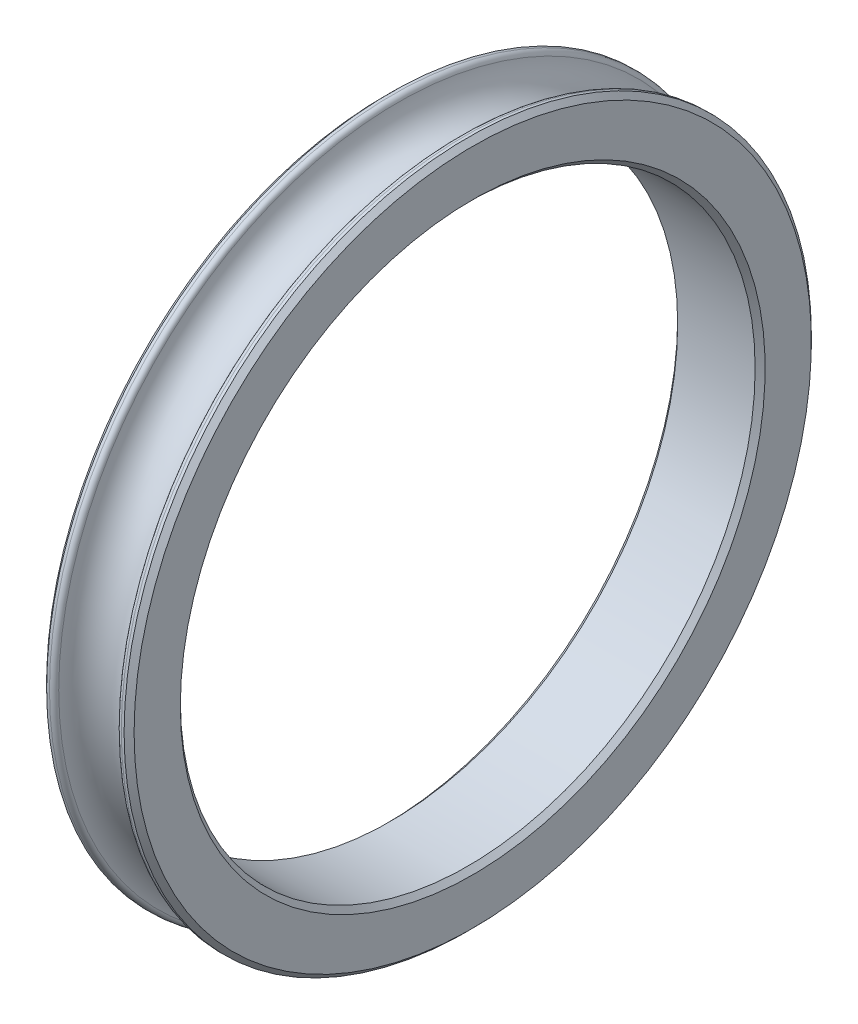
ISO-10303-21;
HEADER;
FILE_DESCRIPTION(('STEP AP214'),'2;1');
FILE_NAME('part.step','',(''),(''),'','','');
FILE_SCHEMA(('AUTOMOTIVE_DESIGN { 1 0 10303 214 1 1 1 1 }'));
ENDSEC;
DATA;
#1=APPLICATION_CONTEXT('core data for automotive mechanical design processes');
#2=APPLICATION_PROTOCOL_DEFINITION('international standard','automotive_design',2000,#1);
#3=PRODUCT_CONTEXT('',#1,'mechanical');
#4=PRODUCT('Part','Part','',(#3));
#5=PRODUCT_RELATED_PRODUCT_CATEGORY('part','',(#4));
#6=PRODUCT_DEFINITION_FORMATION('','',#4);
#7=PRODUCT_DEFINITION_CONTEXT('part definition',#1,'design');
#8=PRODUCT_DEFINITION('design','',#6,#7);
#9=PRODUCT_DEFINITION_SHAPE('','',#8);
#10=(LENGTH_UNIT() NAMED_UNIT(*) SI_UNIT(.MILLI.,.METRE.));
#11=(NAMED_UNIT(*) PLANE_ANGLE_UNIT() SI_UNIT($,.RADIAN.));
#12=(NAMED_UNIT(*) SI_UNIT($,.STERADIAN.) SOLID_ANGLE_UNIT());
#13=UNCERTAINTY_MEASURE_WITH_UNIT(LENGTH_MEASURE(1.E-05),#10,'distance_accuracy_value','');
#14=(GEOMETRIC_REPRESENTATION_CONTEXT(3) GLOBAL_UNCERTAINTY_ASSIGNED_CONTEXT((#13)) GLOBAL_UNIT_ASSIGNED_CONTEXT((#10,
#11,#12)) REPRESENTATION_CONTEXT('',''));
#15=CARTESIAN_POINT('',(0.,0.,0.));
#16=DIRECTION('',(0.,0.,1.));
#17=DIRECTION('',(1.,0.,0.));
#18=AXIS2_PLACEMENT_3D('',#15,#16,#17);
#19=CARTESIAN_POINT('',(0.,0.,0.));
#20=DIRECTION('',(-1.,0.,0.));
#21=DIRECTION('',(0.,0.,1.));
#22=AXIS2_PLACEMENT_3D('',#19,#20,#21);
#23=TOROIDAL_SURFACE('',#22,27.5,2.5);
#24=CARTESIAN_POINT('',(2.47610458902474,0.,0.));
#25=DIRECTION('',(-1.,0.,0.));
#26=DIRECTION('',(0.,0.,1.));
#27=AXIS2_PLACEMENT_3D('',#24,#25,#26);
#28=CIRCLE('',#27,27.1551724137931);
#29=CARTESIAN_POINT('',(2.47610458902474,0.,27.1551724137931));
#30=VERTEX_POINT('',#29);
#31=EDGE_CURVE('E90',#30,#30,#28,.T.);
#32=ORIENTED_EDGE('',*,*,#31,.T.);
#33=EDGE_LOOP('',(#32));
#34=FACE_BOUND('',#33,.T.);
#35=CARTESIAN_POINT('',(-2.47610458902474,0.,0.));
#36=DIRECTION('',(1.,0.,0.));
#37=DIRECTION('',(0.,0.,-1.));
#38=AXIS2_PLACEMENT_3D('',#35,#36,#37);
#39=CIRCLE('',#38,27.1551724137931);
#40=CARTESIAN_POINT('',(-2.47610458902474,0.,-27.1551724137931));
#41=VERTEX_POINT('',#40);
#42=EDGE_CURVE('E94',#41,#41,#39,.T.);
#43=ORIENTED_EDGE('',*,*,#42,.T.);
#44=EDGE_LOOP('',(#43));
#45=FACE_BOUND('',#44,.T.);
#46=ADVANCED_FACE('F41',(#34,#45),#23,.F.);
#47=CARTESIAN_POINT('',(-16.5806488145554,0.,0.));
#48=DIRECTION('',(-1.,0.,0.));
#49=DIRECTION('',(0.,0.,1.));
#50=AXIS2_PLACEMENT_3D('',#47,#48,#49);
#51=CYLINDRICAL_SURFACE('',#50,27.5);
#52=CARTESIAN_POINT('',(-3.09999999999999,0.,0.));
#53=DIRECTION('',(1.,0.,0.));
#54=DIRECTION('',(0.,0.,-1.));
#55=AXIS2_PLACEMENT_3D('',#52,#53,#54);
#56=CIRCLE('',#55,27.5);
#57=CARTESIAN_POINT('',(-3.09999999999999,0.,-27.5));
#58=VERTEX_POINT('',#57);
#59=EDGE_CURVE('E10',#58,#58,#56,.T.);
#60=ORIENTED_EDGE('',*,*,#59,.T.);
#61=EDGE_LOOP('',(#60));
#62=FACE_BOUND('',#61,.T.);
#63=CARTESIAN_POINT('',(-2.87228132326901,0.,0.));
#64=DIRECTION('',(1.,0.,0.));
#65=DIRECTION('',(0.,0.,-1.));
#66=AXIS2_PLACEMENT_3D('',#63,#64,#65);
#67=CIRCLE('',#66,27.5);
#68=CARTESIAN_POINT('',(-2.87228132326901,0.,-27.5));
#69=VERTEX_POINT('',#68);
#70=EDGE_CURVE('E82',#69,#69,#67,.F.);
#71=ORIENTED_EDGE('',*,*,#70,.T.);
#72=EDGE_LOOP('',(#71));
#73=FACE_BOUND('',#72,.T.);
#74=ADVANCED_FACE('F108',(#62,#73),#51,.T.);
#75=CARTESIAN_POINT('',(-3.5,27.5,0.));
#76=DIRECTION('',(1.,0.,0.));
#77=DIRECTION('',(0.,0.,-1.));
#78=AXIS2_PLACEMENT_3D('',#75,#76,#77);
#79=PLANE('',#78);
#80=CARTESIAN_POINT('',(-3.5,0.,0.));
#81=DIRECTION('',(1.,0.,0.));
#82=DIRECTION('',(0.,0.,-1.));
#83=AXIS2_PLACEMENT_3D('',#80,#81,#82);
#84=CIRCLE('',#83,27.1);
#85=CARTESIAN_POINT('',(-3.5,0.,-27.1));
#86=VERTEX_POINT('',#85);
#87=EDGE_CURVE('E50',#86,#86,#84,.F.);
#88=ORIENTED_EDGE('',*,*,#87,.T.);
#89=EDGE_LOOP('',(#88));
#90=FACE_BOUND('',#89,.T.);
#91=CARTESIAN_POINT('',(-3.5,0.,0.));
#92=DIRECTION('',(1.,0.,0.));
#93=DIRECTION('',(0.,0.,-1.));
#94=AXIS2_PLACEMENT_3D('',#91,#92,#93);
#95=CIRCLE('',#94,23.4);
#96=CARTESIAN_POINT('',(-3.5,0.,-23.4));
#97=VERTEX_POINT('',#96);
#98=EDGE_CURVE('E55',#97,#97,#95,.T.);
#99=ORIENTED_EDGE('',*,*,#98,.T.);
#100=EDGE_LOOP('',(#99));
#101=FACE_BOUND('',#100,.T.);
#102=ADVANCED_FACE('F110',(#90,#101),#79,.F.);
#103=CARTESIAN_POINT('',(-16.5806488145554,0.,0.));
#104=DIRECTION('',(-1.,0.,0.));
#105=DIRECTION('',(0.,0.,1.));
#106=AXIS2_PLACEMENT_3D('',#103,#104,#105);
#107=CYLINDRICAL_SURFACE('',#106,23.);
#108=CARTESIAN_POINT('',(3.1,0.,0.));
#109=DIRECTION('',(-1.,0.,0.));
#110=DIRECTION('',(0.,0.,1.));
#111=AXIS2_PLACEMENT_3D('',#108,#109,#110);
#112=CIRCLE('',#111,23.);
#113=CARTESIAN_POINT('',(3.1,0.,23.));
#114=VERTEX_POINT('',#113);
#115=EDGE_CURVE('E66',#114,#114,#112,.F.);
#116=ORIENTED_EDGE('',*,*,#115,.T.);
#117=EDGE_LOOP('',(#116));
#118=FACE_BOUND('',#117,.T.);
#119=CARTESIAN_POINT('',(-3.1,0.,0.));
#120=DIRECTION('',(1.,0.,0.));
#121=DIRECTION('',(0.,0.,-1.));
#122=AXIS2_PLACEMENT_3D('',#119,#120,#121);
#123=CIRCLE('',#122,23.);
#124=CARTESIAN_POINT('',(-3.1,0.,-23.));
#125=VERTEX_POINT('',#124);
#126=EDGE_CURVE('E70',#125,#125,#123,.F.);
#127=ORIENTED_EDGE('',*,*,#126,.T.);
#128=EDGE_LOOP('',(#127));
#129=FACE_BOUND('',#128,.T.);
#130=ADVANCED_FACE('F116',(#118,#129),#107,.F.);
#131=CARTESIAN_POINT('',(3.5,27.5,0.));
#132=DIRECTION('',(-1.,0.,0.));
#133=DIRECTION('',(0.,0.,1.));
#134=AXIS2_PLACEMENT_3D('',#131,#132,#133);
#135=PLANE('',#134);
#136=CARTESIAN_POINT('',(3.5,0.,0.));
#137=DIRECTION('',(-1.,0.,0.));
#138=DIRECTION('',(0.,0.,1.));
#139=AXIS2_PLACEMENT_3D('',#136,#137,#138);
#140=CIRCLE('',#139,23.4);
#141=CARTESIAN_POINT('',(3.5,0.,23.4));
#142=VERTEX_POINT('',#141);
#143=EDGE_CURVE('E74',#142,#142,#140,.T.);
#144=ORIENTED_EDGE('',*,*,#143,.T.);
#145=EDGE_LOOP('',(#144));
#146=FACE_BOUND('',#145,.T.);
#147=CARTESIAN_POINT('',(3.5,0.,0.));
#148=DIRECTION('',(-1.,0.,0.));
#149=DIRECTION('',(0.,0.,1.));
#150=AXIS2_PLACEMENT_3D('',#147,#148,#149);
#151=CIRCLE('',#150,27.1);
#152=CARTESIAN_POINT('',(3.5,0.,27.1));
#153=VERTEX_POINT('',#152);
#154=EDGE_CURVE('E78',#153,#153,#151,.F.);
#155=ORIENTED_EDGE('',*,*,#154,.T.);
#156=EDGE_LOOP('',(#155));
#157=FACE_BOUND('',#156,.T.);
#158=ADVANCED_FACE('F156',(#146,#157),#135,.F.);
#159=CARTESIAN_POINT('',(-16.5806488145554,0.,0.));
#160=DIRECTION('',(-1.,0.,0.));
#161=DIRECTION('',(0.,0.,1.));
#162=AXIS2_PLACEMENT_3D('',#159,#160,#161);
#163=CYLINDRICAL_SURFACE('',#162,27.5);
#164=CARTESIAN_POINT('',(3.1,0.,0.));
#165=DIRECTION('',(-1.,0.,0.));
#166=DIRECTION('',(0.,0.,1.));
#167=AXIS2_PLACEMENT_3D('',#164,#165,#166);
#168=CIRCLE('',#167,27.5);
#169=CARTESIAN_POINT('',(3.1,0.,27.5));
#170=VERTEX_POINT('',#169);
#171=EDGE_CURVE('E60',#170,#170,#168,.T.);
#172=ORIENTED_EDGE('',*,*,#171,.T.);
#173=EDGE_LOOP('',(#172));
#174=FACE_BOUND('',#173,.T.);
#175=CARTESIAN_POINT('',(2.87228132326902,0.,0.));
#176=DIRECTION('',(1.,0.,0.));
#177=DIRECTION('',(0.,0.,-1.));
#178=AXIS2_PLACEMENT_3D('',#175,#176,#177);
#179=CIRCLE('',#178,27.5);
#180=CARTESIAN_POINT('',(2.87228132326902,0.,-27.5));
#181=VERTEX_POINT('',#180);
#182=EDGE_CURVE('E86',#181,#181,#179,.T.);
#183=ORIENTED_EDGE('',*,*,#182,.T.);
#184=EDGE_LOOP('',(#183));
#185=FACE_BOUND('',#184,.T.);
#186=ADVANCED_FACE('F123',(#174,#185),#163,.T.);
#187=CARTESIAN_POINT('',(2.87228132326902,0.,0.));
#188=DIRECTION('',(1.,0.,0.));
#189=DIRECTION('',(0.,0.,-1.));
#190=AXIS2_PLACEMENT_3D('',#187,#188,#189);
#191=TOROIDAL_SURFACE('',#190,27.1,0.4);
#192=ORIENTED_EDGE('',*,*,#182,.F.);
#193=EDGE_LOOP('',(#192));
#194=FACE_BOUND('',#193,.T.);
#195=ORIENTED_EDGE('',*,*,#31,.F.);
#196=EDGE_LOOP('',(#195));
#197=FACE_BOUND('',#196,.T.);
#198=ADVANCED_FACE('F104',(#194,#197),#191,.T.);
#199=CARTESIAN_POINT('',(-2.87228132326901,0.,0.));
#200=DIRECTION('',(1.,0.,0.));
#201=DIRECTION('',(0.,0.,-1.));
#202=AXIS2_PLACEMENT_3D('',#199,#200,#201);
#203=TOROIDAL_SURFACE('',#202,27.1,0.4);
#204=ORIENTED_EDGE('',*,*,#42,.F.);
#205=EDGE_LOOP('',(#204));
#206=FACE_BOUND('',#205,.T.);
#207=ORIENTED_EDGE('',*,*,#70,.F.);
#208=EDGE_LOOP('',(#207));
#209=FACE_BOUND('',#208,.T.);
#210=ADVANCED_FACE('F100',(#206,#209),#203,.T.);
#211=CARTESIAN_POINT('',(3.5,0.,0.));
#212=DIRECTION('',(1.,0.,0.));
#213=DIRECTION('',(0.,0.,-1.));
#214=AXIS2_PLACEMENT_3D('',#211,#212,#213);
#215=CONICAL_SURFACE('',#214,23.4,0.785398163397453);
#216=ORIENTED_EDGE('',*,*,#115,.F.);
#217=EDGE_LOOP('',(#216));
#218=FACE_BOUND('',#217,.T.);
#219=ORIENTED_EDGE('',*,*,#143,.F.);
#220=EDGE_LOOP('',(#219));
#221=FACE_BOUND('',#220,.T.);
#222=ADVANCED_FACE('F103',(#218,#221),#215,.F.);
#223=CARTESIAN_POINT('',(3.1,0.,0.));
#224=DIRECTION('',(-1.,0.,0.));
#225=DIRECTION('',(0.,0.,1.));
#226=AXIS2_PLACEMENT_3D('',#223,#224,#225);
#227=CONICAL_SURFACE('',#226,27.5,0.785398163397444);
#228=ORIENTED_EDGE('',*,*,#154,.F.);
#229=EDGE_LOOP('',(#228));
#230=FACE_BOUND('',#229,.T.);
#231=ORIENTED_EDGE('',*,*,#171,.F.);
#232=EDGE_LOOP('',(#231));
#233=FACE_BOUND('',#232,.T.);
#234=ADVANCED_FACE('F132',(#230,#233),#227,.T.);
#235=CARTESIAN_POINT('',(-3.5,0.,0.));
#236=DIRECTION('',(1.,0.,0.));
#237=DIRECTION('',(0.,0.,-1.));
#238=AXIS2_PLACEMENT_3D('',#235,#236,#237);
#239=CONICAL_SURFACE('',#238,27.1,0.785398163397444);
#240=ORIENTED_EDGE('',*,*,#59,.F.);
#241=EDGE_LOOP('',(#240));
#242=FACE_BOUND('',#241,.T.);
#243=ORIENTED_EDGE('',*,*,#87,.F.);
#244=EDGE_LOOP('',(#243));
#245=FACE_BOUND('',#244,.T.);
#246=ADVANCED_FACE('F138',(#242,#245),#239,.T.);
#247=CARTESIAN_POINT('',(-3.1,0.,0.));
#248=DIRECTION('',(-1.,0.,0.));
#249=DIRECTION('',(0.,0.,1.));
#250=AXIS2_PLACEMENT_3D('',#247,#248,#249);
#251=CONICAL_SURFACE('',#250,23.,0.785398163397453);
#252=ORIENTED_EDGE('',*,*,#98,.F.);
#253=EDGE_LOOP('',(#252));
#254=FACE_BOUND('',#253,.T.);
#255=ORIENTED_EDGE('',*,*,#126,.F.);
#256=EDGE_LOOP('',(#255));
#257=FACE_BOUND('',#256,.T.);
#258=ADVANCED_FACE('F44',(#254,#257),#251,.F.);
#259=CLOSED_SHELL('',(#46,#74,#102,#130,#158,#186,#198,#210,#222,#234,#246,#258));
#260=MANIFOLD_SOLID_BREP('B2',#259);
#261=ADVANCED_BREP_SHAPE_REPRESENTATION('',(#18,#260),#14);
#262=SHAPE_DEFINITION_REPRESENTATION(#9,#261);
ENDSEC;
END-ISO-10303-21;
